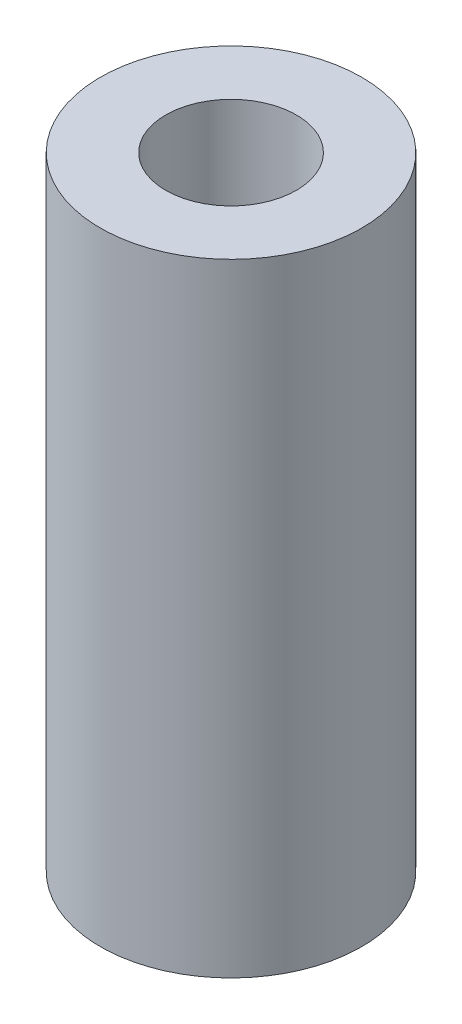
ISO-10303-21;
HEADER;
FILE_DESCRIPTION(('STEP AP214'),'2;1');
FILE_NAME('part.step','',(''),(''),'','','');
FILE_SCHEMA(('AUTOMOTIVE_DESIGN { 1 0 10303 214 1 1 1 1 }'));
ENDSEC;
DATA;
#1=APPLICATION_CONTEXT('core data for automotive mechanical design processes');
#2=APPLICATION_PROTOCOL_DEFINITION('international standard','automotive_design',2000,#1);
#3=PRODUCT_CONTEXT('',#1,'mechanical');
#4=PRODUCT('Part','Part','',(#3));
#5=PRODUCT_RELATED_PRODUCT_CATEGORY('part','',(#4));
#6=PRODUCT_DEFINITION_FORMATION('','',#4);
#7=PRODUCT_DEFINITION_CONTEXT('part definition',#1,'design');
#8=PRODUCT_DEFINITION('design','',#6,#7);
#9=PRODUCT_DEFINITION_SHAPE('','',#8);
#10=(LENGTH_UNIT() NAMED_UNIT(*) SI_UNIT(.MILLI.,.METRE.));
#11=(NAMED_UNIT(*) PLANE_ANGLE_UNIT() SI_UNIT($,.RADIAN.));
#12=(NAMED_UNIT(*) SI_UNIT($,.STERADIAN.) SOLID_ANGLE_UNIT());
#13=UNCERTAINTY_MEASURE_WITH_UNIT(LENGTH_MEASURE(1.E-05),#10,'distance_accuracy_value','');
#14=(GEOMETRIC_REPRESENTATION_CONTEXT(3) GLOBAL_UNCERTAINTY_ASSIGNED_CONTEXT((#13)) GLOBAL_UNIT_ASSIGNED_CONTEXT((#10,
#11,#12)) REPRESENTATION_CONTEXT('',''));
#15=CARTESIAN_POINT('',(0.,0.,0.));
#16=DIRECTION('',(0.,0.,1.));
#17=DIRECTION('',(1.,0.,0.));
#18=AXIS2_PLACEMENT_3D('',#15,#16,#17);
#19=CARTESIAN_POINT('',(0.,9.525,0.));
#20=DIRECTION('',(0.,-1.,0.));
#21=DIRECTION('',(0.,0.,-1.));
#22=AXIS2_PLACEMENT_3D('',#19,#20,#21);
#23=CYLINDRICAL_SURFACE('',#22,4.);
#24=CARTESIAN_POINT('',(0.,9.525,0.));
#25=DIRECTION('',(0.,1.,0.));
#26=DIRECTION('',(0.,0.,1.));
#27=AXIS2_PLACEMENT_3D('',#24,#25,#26);
#28=CIRCLE('',#27,4.);
#29=CARTESIAN_POINT('',(0.,9.525,-4.));
#30=VERTEX_POINT('',#29);
#31=EDGE_CURVE('E10',#30,#30,#28,.T.);
#32=CARTESIAN_POINT('',(0.,-9.525,0.));
#33=DIRECTION('',(0.,1.,0.));
#34=DIRECTION('',(0.,0.,1.));
#35=AXIS2_PLACEMENT_3D('',#32,#33,#34);
#36=CIRCLE('',#35,4.);
#37=CARTESIAN_POINT('',(0.,-9.525,-4.));
#38=VERTEX_POINT('',#37);
#39=EDGE_CURVE('E34',#38,#38,#36,.T.);
#40=CARTESIAN_POINT('',(0.,9.525,-4.));
#41=CARTESIAN_POINT('',(0.,9.3265625,-4.));
#42=CARTESIAN_POINT('',(0.,9.128125,-4.));
#43=CARTESIAN_POINT('',(0.,8.73125,-4.));
#44=CARTESIAN_POINT('',(0.,8.5328125,-4.));
#45=CARTESIAN_POINT('',(0.,8.1359375,-4.));
#46=CARTESIAN_POINT('',(0.,7.9375,-4.));
#47=CARTESIAN_POINT('',(0.,7.540625,-4.));
#48=CARTESIAN_POINT('',(0.,7.3421875,-4.));
#49=CARTESIAN_POINT('',(0.,6.9453125,-4.));
#50=CARTESIAN_POINT('',(0.,6.746875,-4.));
#51=CARTESIAN_POINT('',(0.,6.35,-4.));
#52=CARTESIAN_POINT('',(0.,6.1515625,-4.));
#53=CARTESIAN_POINT('',(0.,5.7546875,-4.));
#54=CARTESIAN_POINT('',(0.,5.55625,-4.));
#55=CARTESIAN_POINT('',(0.,5.159375,-4.));
#56=CARTESIAN_POINT('',(0.,4.9609375,-4.));
#57=CARTESIAN_POINT('',(0.,4.5640625,-4.));
#58=CARTESIAN_POINT('',(0.,4.365625,-4.));
#59=CARTESIAN_POINT('',(0.,3.96875,-4.));
#60=CARTESIAN_POINT('',(0.,3.7703125,-4.));
#61=CARTESIAN_POINT('',(0.,3.3734375,-4.));
#62=CARTESIAN_POINT('',(0.,3.175,-4.));
#63=CARTESIAN_POINT('',(0.,2.778125,-4.));
#64=CARTESIAN_POINT('',(0.,2.5796875,-4.));
#65=CARTESIAN_POINT('',(0.,2.1828125,-4.));
#66=CARTESIAN_POINT('',(0.,1.984375,-4.));
#67=CARTESIAN_POINT('',(0.,1.5875,-4.));
#68=CARTESIAN_POINT('',(0.,1.3890625,-4.));
#69=CARTESIAN_POINT('',(0.,0.992187499999999,-4.));
#70=CARTESIAN_POINT('',(0.,0.793749999999999,-4.));
#71=CARTESIAN_POINT('',(0.,0.396874999999998,-4.));
#72=CARTESIAN_POINT('',(0.,0.198437499999998,-4.));
#73=CARTESIAN_POINT('',(0.,-0.198437500000002,-4.));
#74=CARTESIAN_POINT('',(0.,-0.396875000000002,-4.));
#75=CARTESIAN_POINT('',(0.,-0.793750000000002,-4.));
#76=CARTESIAN_POINT('',(0.,-0.992187500000002,-4.));
#77=CARTESIAN_POINT('',(0.,-1.3890625,-4.));
#78=CARTESIAN_POINT('',(0.,-1.5875,-4.));
#79=CARTESIAN_POINT('',(0.,-1.984375,-4.));
#80=CARTESIAN_POINT('',(0.,-2.1828125,-4.));
#81=CARTESIAN_POINT('',(0.,-2.5796875,-4.));
#82=CARTESIAN_POINT('',(0.,-2.778125,-4.));
#83=CARTESIAN_POINT('',(0.,-3.175,-4.));
#84=CARTESIAN_POINT('',(0.,-3.3734375,-4.));
#85=CARTESIAN_POINT('',(0.,-3.7703125,-4.));
#86=CARTESIAN_POINT('',(0.,-3.96875,-4.));
#87=CARTESIAN_POINT('',(0.,-4.365625,-4.));
#88=CARTESIAN_POINT('',(0.,-4.5640625,-4.));
#89=CARTESIAN_POINT('',(0.,-4.9609375,-4.));
#90=CARTESIAN_POINT('',(0.,-5.159375,-4.));
#91=CARTESIAN_POINT('',(0.,-5.55625,-4.));
#92=CARTESIAN_POINT('',(0.,-5.7546875,-4.));
#93=CARTESIAN_POINT('',(0.,-6.1515625,-4.));
#94=CARTESIAN_POINT('',(0.,-6.35,-4.));
#95=CARTESIAN_POINT('',(0.,-6.746875,-4.));
#96=CARTESIAN_POINT('',(0.,-6.9453125,-4.));
#97=CARTESIAN_POINT('',(0.,-7.3421875,-4.));
#98=CARTESIAN_POINT('',(0.,-7.540625,-4.));
#99=CARTESIAN_POINT('',(0.,-7.9375,-4.));
#100=CARTESIAN_POINT('',(0.,-8.1359375,-4.));
#101=CARTESIAN_POINT('',(0.,-8.5328125,-4.));
#102=CARTESIAN_POINT('',(0.,-8.73125,-4.));
#103=CARTESIAN_POINT('',(0.,-9.128125,-4.));
#104=CARTESIAN_POINT('',(0.,-9.3265625,-4.));
#105=CARTESIAN_POINT('',(0.,-9.525,-4.));
#106=B_SPLINE_CURVE_WITH_KNOTS('',3,(#40,#41,#42,#43,#44,#45,#46,#47,#48,#49,#50,#51,#52,#53,
#54,#55,#56,#57,#58,#59,#60,#61,#62,#63,#64,#65,#66,#67,#68,#69,#70,#71,#72,#73,#74,#75,#76,#77,
#78,#79,#80,#81,#82,#83,#84,#85,#86,#87,#88,#89,#90,#91,#92,#93,#94,#95,#96,#97,#98,#99,#100,
#101,#102,#103,#104,#105),.UNSPECIFIED.,.F.,.F.,(4,2,2,2,2,2,2,2,2,2,2,2,2,2,2,2,2,2,2,2,2,2,2,
2,2,2,2,2,2,2,2,2,4),(0.,0.595312499999999,1.190625,1.7859375,2.38125,2.9765625,3.571875,
4.1671875,4.7625,5.3578125,5.953125,6.5484375,7.14375,7.7390625,8.334375,8.9296875,9.525,
10.1203125,10.715625,11.3109375,11.90625,12.5015625,13.096875,13.6921875,14.2875,14.8828125,
15.478125,16.0734375,16.66875,17.2640625,17.859375,18.4546875,19.05),.UNSPECIFIED.);
#107=EDGE_CURVE('BSEAM31',#30,#38,#106,.T.);
#108=ORIENTED_EDGE('',*,*,#31,.F.);
#109=ORIENTED_EDGE('',*,*,#39,.T.);
#110=ORIENTED_EDGE('',*,*,#107,.T.);
#111=ORIENTED_EDGE('',*,*,#107,.F.);
#112=EDGE_LOOP('',(#108,#110,#109,#111));
#113=FACE_BOUND('',#112,.T.);
#114=ADVANCED_FACE('F31',(#113),#23,.T.);
#115=CARTESIAN_POINT('',(0.,9.525,0.));
#116=DIRECTION('',(0.,1.,0.));
#117=DIRECTION('',(0.,0.,1.));
#118=AXIS2_PLACEMENT_3D('',#115,#116,#117);
#119=PLANE('',#118);
#120=CARTESIAN_POINT('',(0.,9.525,0.));
#121=DIRECTION('',(0.,1.,0.));
#122=DIRECTION('',(0.,0.,1.));
#123=AXIS2_PLACEMENT_3D('',#120,#121,#122);
#124=CIRCLE('',#123,2.);
#125=CARTESIAN_POINT('',(0.,9.525,2.));
#126=VERTEX_POINT('',#125);
#127=EDGE_CURVE('E43',#126,#126,#124,.T.);
#128=ORIENTED_EDGE('',*,*,#127,.F.);
#129=EDGE_LOOP('',(#128));
#130=FACE_BOUND('',#129,.T.);
#131=ORIENTED_EDGE('',*,*,#31,.T.);
#132=EDGE_LOOP('',(#131));
#133=FACE_BOUND('',#132,.T.);
#134=ADVANCED_FACE('F67',(#130,#133),#119,.T.);
#135=CARTESIAN_POINT('',(0.,-9.525,0.));
#136=DIRECTION('',(0.,1.,0.));
#137=DIRECTION('',(0.,0.,1.));
#138=AXIS2_PLACEMENT_3D('',#135,#136,#137);
#139=PLANE('',#138);
#140=CARTESIAN_POINT('',(0.,-9.525,0.));
#141=DIRECTION('',(0.,1.,0.));
#142=DIRECTION('',(0.,0.,1.));
#143=AXIS2_PLACEMENT_3D('',#140,#141,#142);
#144=CIRCLE('',#143,2.);
#145=CARTESIAN_POINT('',(0.,-9.525,2.));
#146=VERTEX_POINT('',#145);
#147=EDGE_CURVE('E49',#146,#146,#144,.T.);
#148=ORIENTED_EDGE('',*,*,#147,.T.);
#149=EDGE_LOOP('',(#148));
#150=FACE_BOUND('',#149,.T.);
#151=ORIENTED_EDGE('',*,*,#39,.F.);
#152=EDGE_LOOP('',(#151));
#153=FACE_BOUND('',#152,.T.);
#154=ADVANCED_FACE('F72',(#150,#153),#139,.F.);
#155=CARTESIAN_POINT('',(0.,3.175,0.));
#156=DIRECTION('',(0.,1.,0.));
#157=DIRECTION('',(0.,0.,1.));
#158=AXIS2_PLACEMENT_3D('',#155,#156,#157);
#159=CYLINDRICAL_SURFACE('',#158,2.);
#160=CARTESIAN_POINT('',(0.,3.175,0.));
#161=DIRECTION('',(0.,1.,0.));
#162=DIRECTION('',(0.,0.,1.));
#163=AXIS2_PLACEMENT_3D('',#160,#161,#162);
#164=CIRCLE('',#163,2.);
#165=CARTESIAN_POINT('',(0.,3.175,2.));
#166=VERTEX_POINT('',#165);
#167=EDGE_CURVE('E41',#166,#166,#164,.T.);
#168=ORIENTED_EDGE('',*,*,#167,.F.);
#169=EDGE_LOOP('',(#168));
#170=FACE_BOUND('',#169,.T.);
#171=ORIENTED_EDGE('',*,*,#127,.T.);
#172=EDGE_LOOP('',(#171));
#173=FACE_BOUND('',#172,.T.);
#174=ADVANCED_FACE('F79',(#170,#173),#159,.F.);
#175=CARTESIAN_POINT('',(0.,3.175,0.));
#176=DIRECTION('',(0.,1.,0.));
#177=DIRECTION('',(0.,0.,1.));
#178=AXIS2_PLACEMENT_3D('',#175,#176,#177);
#179=PLANE('',#178);
#180=ORIENTED_EDGE('',*,*,#167,.T.);
#181=EDGE_LOOP('',(#180));
#182=FACE_BOUND('',#181,.T.);
#183=ADVANCED_FACE('F64',(#182),#179,.T.);
#184=CARTESIAN_POINT('',(0.,-3.175,0.));
#185=DIRECTION('',(0.,-1.,0.));
#186=DIRECTION('',(0.,0.,-1.));
#187=AXIS2_PLACEMENT_3D('',#184,#185,#186);
#188=CYLINDRICAL_SURFACE('',#187,2.);
#189=CARTESIAN_POINT('',(0.,-3.175,0.));
#190=DIRECTION('',(0.,1.,0.));
#191=DIRECTION('',(0.,0.,1.));
#192=AXIS2_PLACEMENT_3D('',#189,#190,#191);
#193=CIRCLE('',#192,2.);
#194=CARTESIAN_POINT('',(0.,-3.175,2.));
#195=VERTEX_POINT('',#194);
#196=EDGE_CURVE('E46',#195,#195,#193,.T.);
#197=ORIENTED_EDGE('',*,*,#196,.T.);
#198=EDGE_LOOP('',(#197));
#199=FACE_BOUND('',#198,.T.);
#200=ORIENTED_EDGE('',*,*,#147,.F.);
#201=EDGE_LOOP('',(#200));
#202=FACE_BOUND('',#201,.T.);
#203=ADVANCED_FACE('F55',(#199,#202),#188,.F.);
#204=CARTESIAN_POINT('',(0.,-3.175,0.));
#205=DIRECTION('',(0.,-1.,0.));
#206=DIRECTION('',(0.,0.,1.));
#207=AXIS2_PLACEMENT_3D('',#204,#205,#206);
#208=PLANE('',#207);
#209=ORIENTED_EDGE('',*,*,#196,.F.);
#210=EDGE_LOOP('',(#209));
#211=FACE_BOUND('',#210,.T.);
#212=ADVANCED_FACE('F58',(#211),#208,.T.);
#213=CLOSED_SHELL('',(#114,#134,#154,#174,#183,#203,#212));
#214=MANIFOLD_SOLID_BREP('B2',#213);
#215=ADVANCED_BREP_SHAPE_REPRESENTATION('',(#18,#214),#14);
#216=SHAPE_DEFINITION_REPRESENTATION(#9,#215);
ENDSEC;
END-ISO-10303-21;
